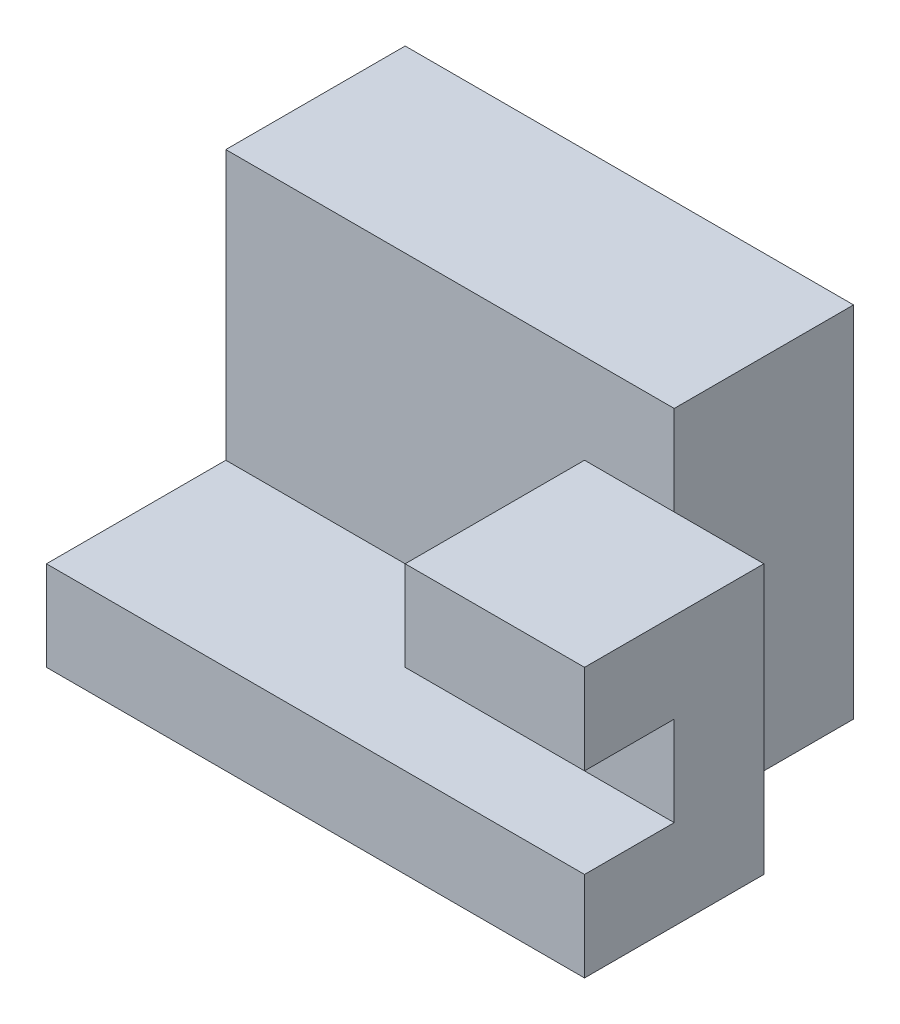
ISO-10303-21;
HEADER;
FILE_DESCRIPTION(('STEP AP214'),'2;1');
FILE_NAME('part.step','',(''),(''),'','','');
FILE_SCHEMA(('AUTOMOTIVE_DESIGN { 1 0 10303 214 1 1 1 1 }'));
ENDSEC;
DATA;
#1=APPLICATION_CONTEXT('core data for automotive mechanical design processes');
#2=APPLICATION_PROTOCOL_DEFINITION('international standard','automotive_design',2000,#1);
#3=PRODUCT_CONTEXT('',#1,'mechanical');
#4=PRODUCT('Part','Part','',(#3));
#5=PRODUCT_RELATED_PRODUCT_CATEGORY('part','',(#4));
#6=PRODUCT_DEFINITION_FORMATION('','',#4);
#7=PRODUCT_DEFINITION_CONTEXT('part definition',#1,'design');
#8=PRODUCT_DEFINITION('design','',#6,#7);
#9=PRODUCT_DEFINITION_SHAPE('','',#8);
#10=(LENGTH_UNIT() NAMED_UNIT(*) SI_UNIT(.MILLI.,.METRE.));
#11=(NAMED_UNIT(*) PLANE_ANGLE_UNIT() SI_UNIT($,.RADIAN.));
#12=(NAMED_UNIT(*) SI_UNIT($,.STERADIAN.) SOLID_ANGLE_UNIT());
#13=UNCERTAINTY_MEASURE_WITH_UNIT(LENGTH_MEASURE(1.E-05),#10,'distance_accuracy_value','');
#14=(GEOMETRIC_REPRESENTATION_CONTEXT(3) GLOBAL_UNCERTAINTY_ASSIGNED_CONTEXT((#13)) GLOBAL_UNIT_ASSIGNED_CONTEXT((#10,
#11,#12)) REPRESENTATION_CONTEXT('',''));
#15=CARTESIAN_POINT('',(0.,0.,0.));
#16=DIRECTION('',(0.,0.,1.));
#17=DIRECTION('',(1.,0.,0.));
#18=AXIS2_PLACEMENT_3D('',#15,#16,#17);
#19=CARTESIAN_POINT('',(-25.,0.,10.));
#20=DIRECTION('',(0.,0.,-1.));
#21=DIRECTION('',(-1.,0.,0.));
#22=AXIS2_PLACEMENT_3D('',#19,#20,#21);
#23=PLANE('',#22);
#24=DIRECTION('',(0.,-1.,0.));
#25=VECTOR('',#24,1.);
#26=CARTESIAN_POINT('',(5.,0.,10.));
#27=LINE('',#26,#25);
#28=CARTESIAN_POINT('',(5.,5.,10.));
#29=VERTEX_POINT('',#28);
#30=CARTESIAN_POINT('',(5.,0.,10.));
#31=VERTEX_POINT('',#30);
#32=EDGE_CURVE('E158',#29,#31,#27,.T.);
#33=ORIENTED_EDGE('',*,*,#32,.F.);
#34=DIRECTION('',(1.,0.,0.));
#35=VECTOR('',#34,1.);
#36=CARTESIAN_POINT('',(-25.,5.,10.));
#37=LINE('',#36,#35);
#38=CARTESIAN_POINT('',(-25.,5.,10.));
#39=VERTEX_POINT('',#38);
#40=EDGE_CURVE('E11',#39,#29,#37,.T.);
#41=ORIENTED_EDGE('',*,*,#40,.F.);
#42=DIRECTION('',(0.,1.,0.));
#43=VECTOR('',#42,1.);
#44=CARTESIAN_POINT('',(-25.,0.,10.));
#45=LINE('',#44,#43);
#46=CARTESIAN_POINT('',(-25.,0.,10.));
#47=VERTEX_POINT('',#46);
#48=EDGE_CURVE('E188',#47,#39,#45,.T.);
#49=ORIENTED_EDGE('',*,*,#48,.F.);
#50=DIRECTION('',(1.,0.,0.));
#51=VECTOR('',#50,1.);
#52=CARTESIAN_POINT('',(-25.,0.,10.));
#53=LINE('',#52,#51);
#54=EDGE_CURVE('E36',#47,#31,#53,.T.);
#55=ORIENTED_EDGE('',*,*,#54,.T.);
#56=EDGE_LOOP('',(#33,#41,#49,#55));
#57=FACE_BOUND('',#56,.T.);
#58=ADVANCED_FACE('F33',(#57),#23,.F.);
#59=CARTESIAN_POINT('',(-25.,5.,0.));
#60=DIRECTION('',(0.,1.,0.));
#61=DIRECTION('',(0.,0.,1.));
#62=AXIS2_PLACEMENT_3D('',#59,#60,#61);
#63=PLANE('',#62);
#64=DIRECTION('',(1.,0.,0.));
#65=VECTOR('',#64,1.);
#66=CARTESIAN_POINT('',(-5.,5.,5.));
#67=LINE('',#66,#65);
#68=CARTESIAN_POINT('',(-5.,5.,5.));
#69=VERTEX_POINT('',#68);
#70=CARTESIAN_POINT('',(5.,5.,5.));
#71=VERTEX_POINT('',#70);
#72=EDGE_CURVE('E49',#69,#71,#67,.T.);
#73=ORIENTED_EDGE('',*,*,#72,.F.);
#74=DIRECTION('',(0.,0.,-1.));
#75=VECTOR('',#74,1.);
#76=CARTESIAN_POINT('',(-5.,5.,0.));
#77=LINE('',#76,#75);
#78=CARTESIAN_POINT('',(-5.,5.,0.));
#79=VERTEX_POINT('',#78);
#80=EDGE_CURVE('E178',#69,#79,#77,.T.);
#81=ORIENTED_EDGE('',*,*,#80,.T.);
#82=DIRECTION('',(1.,0.,0.));
#83=VECTOR('',#82,1.);
#84=CARTESIAN_POINT('',(-25.,5.,0.));
#85=LINE('',#84,#83);
#86=CARTESIAN_POINT('',(-25.,5.,0.));
#87=VERTEX_POINT('',#86);
#88=EDGE_CURVE('E41',#87,#79,#85,.T.);
#89=ORIENTED_EDGE('',*,*,#88,.F.);
#90=DIRECTION('',(0.,0.,1.));
#91=VECTOR('',#90,1.);
#92=CARTESIAN_POINT('',(-25.,5.,0.));
#93=LINE('',#92,#91);
#94=EDGE_CURVE('E200',#87,#39,#93,.T.);
#95=ORIENTED_EDGE('',*,*,#94,.T.);
#96=ORIENTED_EDGE('',*,*,#40,.T.);
#97=DIRECTION('',(0.,0.,1.));
#98=VECTOR('',#97,1.);
#99=CARTESIAN_POINT('',(5.,5.,5.));
#100=LINE('',#99,#98);
#101=EDGE_CURVE('E155',#71,#29,#100,.T.);
#102=ORIENTED_EDGE('',*,*,#101,.F.);
#103=EDGE_LOOP('',(#73,#81,#89,#95,#96,#102));
#104=FACE_BOUND('',#103,.T.);
#105=ADVANCED_FACE('F243',(#104),#63,.T.);
#106=CARTESIAN_POINT('',(-25.,0.,0.));
#107=DIRECTION('',(0.,0.,-1.));
#108=DIRECTION('',(-1.,0.,0.));
#109=AXIS2_PLACEMENT_3D('',#106,#107,#108);
#110=PLANE('',#109);
#111=DIRECTION('',(0.,1.,0.));
#112=VECTOR('',#111,1.);
#113=CARTESIAN_POINT('',(-5.,15.,0.));
#114=LINE('',#113,#112);
#115=CARTESIAN_POINT('',(-5.,15.,0.));
#116=VERTEX_POINT('',#115);
#117=EDGE_CURVE('E57',#79,#116,#114,.T.);
#118=ORIENTED_EDGE('',*,*,#117,.T.);
#119=DIRECTION('',(1.,0.,0.));
#120=VECTOR('',#119,1.);
#121=CARTESIAN_POINT('',(-5.,15.,0.));
#122=LINE('',#121,#120);
#123=CARTESIAN_POINT('',(0.,15.,0.));
#124=VERTEX_POINT('',#123);
#125=EDGE_CURVE('E179',#116,#124,#122,.T.);
#126=ORIENTED_EDGE('',*,*,#125,.T.);
#127=DIRECTION('',(0.,1.,0.));
#128=VECTOR('',#127,1.);
#129=CARTESIAN_POINT('',(0.,0.,0.));
#130=LINE('',#129,#128);
#131=CARTESIAN_POINT('',(0.,20.,0.));
#132=VERTEX_POINT('',#131);
#133=EDGE_CURVE('E211',#124,#132,#130,.T.);
#134=ORIENTED_EDGE('',*,*,#133,.T.);
#135=DIRECTION('',(1.,0.,0.));
#136=VECTOR('',#135,1.);
#137=CARTESIAN_POINT('',(-25.,20.,0.));
#138=LINE('',#137,#136);
#139=CARTESIAN_POINT('',(-25.,20.,0.));
#140=VERTEX_POINT('',#139);
#141=EDGE_CURVE('E215',#140,#132,#138,.T.);
#142=ORIENTED_EDGE('',*,*,#141,.F.);
#143=DIRECTION('',(0.,1.,0.));
#144=VECTOR('',#143,1.);
#145=CARTESIAN_POINT('',(-25.,0.,0.));
#146=LINE('',#145,#144);
#147=EDGE_CURVE('E198',#87,#140,#146,.T.);
#148=ORIENTED_EDGE('',*,*,#147,.F.);
#149=ORIENTED_EDGE('',*,*,#88,.T.);
#150=EDGE_LOOP('',(#118,#126,#134,#142,#148,#149));
#151=FACE_BOUND('',#150,.T.);
#152=ADVANCED_FACE('F259',(#151),#110,.F.);
#153=CARTESIAN_POINT('',(-25.,20.,0.));
#154=DIRECTION('',(0.,-1.,0.));
#155=DIRECTION('',(0.,0.,-1.));
#156=AXIS2_PLACEMENT_3D('',#153,#154,#155);
#157=PLANE('',#156);
#158=DIRECTION('',(0.,0.,-1.));
#159=VECTOR('',#158,1.);
#160=CARTESIAN_POINT('',(0.,20.,0.));
#161=LINE('',#160,#159);
#162=CARTESIAN_POINT('',(0.,20.,-10.));
#163=VERTEX_POINT('',#162);
#164=EDGE_CURVE('E208',#132,#163,#161,.T.);
#165=ORIENTED_EDGE('',*,*,#164,.T.);
#166=DIRECTION('',(1.,0.,0.));
#167=VECTOR('',#166,1.);
#168=CARTESIAN_POINT('',(-25.,20.,-10.));
#169=LINE('',#168,#167);
#170=CARTESIAN_POINT('',(-25.,20.,-10.));
#171=VERTEX_POINT('',#170);
#172=EDGE_CURVE('E218',#171,#163,#169,.T.);
#173=ORIENTED_EDGE('',*,*,#172,.F.);
#174=DIRECTION('',(0.,0.,-1.));
#175=VECTOR('',#174,1.);
#176=CARTESIAN_POINT('',(-25.,20.,0.));
#177=LINE('',#176,#175);
#178=EDGE_CURVE('E196',#140,#171,#177,.T.);
#179=ORIENTED_EDGE('',*,*,#178,.F.);
#180=ORIENTED_EDGE('',*,*,#141,.T.);
#181=EDGE_LOOP('',(#165,#173,#179,#180));
#182=FACE_BOUND('',#181,.T.);
#183=ADVANCED_FACE('F261',(#182),#157,.F.);
#184=CARTESIAN_POINT('',(-25.,0.,-10.));
#185=DIRECTION('',(0.,0.,-1.));
#186=DIRECTION('',(-1.,0.,0.));
#187=AXIS2_PLACEMENT_3D('',#184,#185,#186);
#188=PLANE('',#187);
#189=DIRECTION('',(0.,1.,0.));
#190=VECTOR('',#189,1.);
#191=CARTESIAN_POINT('',(0.,0.,-10.));
#192=LINE('',#191,#190);
#193=CARTESIAN_POINT('',(0.,0.,-10.));
#194=VERTEX_POINT('',#193);
#195=EDGE_CURVE('E205',#194,#163,#192,.T.);
#196=ORIENTED_EDGE('',*,*,#195,.F.);
#197=DIRECTION('',(1.,0.,0.));
#198=VECTOR('',#197,1.);
#199=CARTESIAN_POINT('',(-25.,0.,-10.));
#200=LINE('',#199,#198);
#201=CARTESIAN_POINT('',(-25.,0.,-10.));
#202=VERTEX_POINT('',#201);
#203=EDGE_CURVE('E219',#202,#194,#200,.T.);
#204=ORIENTED_EDGE('',*,*,#203,.F.);
#205=DIRECTION('',(0.,1.,0.));
#206=VECTOR('',#205,1.);
#207=CARTESIAN_POINT('',(-25.,0.,-10.));
#208=LINE('',#207,#206);
#209=EDGE_CURVE('E193',#202,#171,#208,.T.);
#210=ORIENTED_EDGE('',*,*,#209,.T.);
#211=ORIENTED_EDGE('',*,*,#172,.T.);
#212=EDGE_LOOP('',(#196,#204,#210,#211));
#213=FACE_BOUND('',#212,.T.);
#214=ADVANCED_FACE('F254',(#213),#188,.T.);
#215=CARTESIAN_POINT('',(-25.,0.,0.));
#216=DIRECTION('',(0.,1.,0.));
#217=DIRECTION('',(0.,0.,1.));
#218=AXIS2_PLACEMENT_3D('',#215,#216,#217);
#219=PLANE('',#218);
#220=DIRECTION('',(0.,0.,1.));
#221=VECTOR('',#220,1.);
#222=CARTESIAN_POINT('',(0.,0.,0.));
#223=LINE('',#222,#221);
#224=CARTESIAN_POINT('',(0.,0.,0.));
#225=VERTEX_POINT('',#224);
#226=EDGE_CURVE('E187',#194,#225,#223,.T.);
#227=ORIENTED_EDGE('',*,*,#226,.T.);
#228=DIRECTION('',(1.,0.,0.));
#229=VECTOR('',#228,1.);
#230=CARTESIAN_POINT('',(-5.,0.,0.));
#231=LINE('',#230,#229);
#232=CARTESIAN_POINT('',(5.,0.,0.));
#233=VERTEX_POINT('',#232);
#234=EDGE_CURVE('E182',#225,#233,#231,.T.);
#235=ORIENTED_EDGE('',*,*,#234,.T.);
#236=DIRECTION('',(0.,0.,-1.));
#237=VECTOR('',#236,1.);
#238=CARTESIAN_POINT('',(5.,0.,0.));
#239=LINE('',#238,#237);
#240=EDGE_CURVE('E161',#31,#233,#239,.T.);
#241=ORIENTED_EDGE('',*,*,#240,.F.);
#242=ORIENTED_EDGE('',*,*,#54,.F.);
#243=DIRECTION('',(0.,0.,1.));
#244=VECTOR('',#243,1.);
#245=CARTESIAN_POINT('',(-25.,0.,0.));
#246=LINE('',#245,#244);
#247=EDGE_CURVE('E190',#202,#47,#246,.T.);
#248=ORIENTED_EDGE('',*,*,#247,.F.);
#249=ORIENTED_EDGE('',*,*,#203,.T.);
#250=EDGE_LOOP('',(#227,#235,#241,#242,#248,#249));
#251=FACE_BOUND('',#250,.T.);
#252=ADVANCED_FACE('F230',(#251),#219,.F.);
#253=CARTESIAN_POINT('',(-25.,0.,0.));
#254=DIRECTION('',(1.,0.,0.));
#255=DIRECTION('',(0.,0.,-1.));
#256=AXIS2_PLACEMENT_3D('',#253,#254,#255);
#257=PLANE('',#256);
#258=ORIENTED_EDGE('',*,*,#48,.T.);
#259=ORIENTED_EDGE('',*,*,#94,.F.);
#260=ORIENTED_EDGE('',*,*,#147,.T.);
#261=ORIENTED_EDGE('',*,*,#178,.T.);
#262=ORIENTED_EDGE('',*,*,#209,.F.);
#263=ORIENTED_EDGE('',*,*,#247,.T.);
#264=EDGE_LOOP('',(#258,#259,#260,#261,#262,#263));
#265=FACE_BOUND('',#264,.T.);
#266=ADVANCED_FACE('F247',(#265),#257,.F.);
#267=CARTESIAN_POINT('',(0.,0.,0.));
#268=DIRECTION('',(1.,0.,0.));
#269=DIRECTION('',(0.,0.,-1.));
#270=AXIS2_PLACEMENT_3D('',#267,#268,#269);
#271=PLANE('',#270);
#272=EDGE_CURVE('E191',#225,#124,#130,.T.);
#273=ORIENTED_EDGE('',*,*,#272,.F.);
#274=ORIENTED_EDGE('',*,*,#226,.F.);
#275=ORIENTED_EDGE('',*,*,#195,.T.);
#276=ORIENTED_EDGE('',*,*,#164,.F.);
#277=ORIENTED_EDGE('',*,*,#133,.F.);
#278=EDGE_LOOP('',(#273,#274,#275,#276,#277));
#279=FACE_BOUND('',#278,.T.);
#280=ADVANCED_FACE('F257',(#279),#271,.T.);
#281=CARTESIAN_POINT('',(-5.,15.,10.));
#282=DIRECTION('',(0.,0.,1.));
#283=DIRECTION('',(1.,0.,0.));
#284=AXIS2_PLACEMENT_3D('',#281,#282,#283);
#285=PLANE('',#284);
#286=DIRECTION('',(1.,0.,0.));
#287=VECTOR('',#286,1.);
#288=CARTESIAN_POINT('',(-5.,10.,10.));
#289=LINE('',#288,#287);
#290=CARTESIAN_POINT('',(-5.,10.,10.));
#291=VERTEX_POINT('',#290);
#292=CARTESIAN_POINT('',(5.,10.,10.));
#293=VERTEX_POINT('',#292);
#294=EDGE_CURVE('E126',#291,#293,#289,.T.);
#295=ORIENTED_EDGE('',*,*,#294,.T.);
#296=DIRECTION('',(0.,-1.,0.));
#297=VECTOR('',#296,1.);
#298=CARTESIAN_POINT('',(5.,15.,10.));
#299=LINE('',#298,#297);
#300=CARTESIAN_POINT('',(5.,15.,10.));
#301=VERTEX_POINT('',#300);
#302=EDGE_CURVE('E130',#301,#293,#299,.T.);
#303=ORIENTED_EDGE('',*,*,#302,.F.);
#304=DIRECTION('',(1.,0.,0.));
#305=VECTOR('',#304,1.);
#306=CARTESIAN_POINT('',(-5.,15.,10.));
#307=LINE('',#306,#305);
#308=CARTESIAN_POINT('',(-5.,15.,10.));
#309=VERTEX_POINT('',#308);
#310=EDGE_CURVE('E176',#309,#301,#307,.T.);
#311=ORIENTED_EDGE('',*,*,#310,.F.);
#312=DIRECTION('',(0.,-1.,0.));
#313=VECTOR('',#312,1.);
#314=CARTESIAN_POINT('',(-5.,15.,10.));
#315=LINE('',#314,#313);
#316=EDGE_CURVE('E132',#309,#291,#315,.T.);
#317=ORIENTED_EDGE('',*,*,#316,.T.);
#318=EDGE_LOOP('',(#295,#303,#311,#317));
#319=FACE_BOUND('',#318,.T.);
#320=ADVANCED_FACE('F128',(#319),#285,.T.);
#321=CARTESIAN_POINT('',(-5.,15.,10.));
#322=DIRECTION('',(0.,1.,0.));
#323=DIRECTION('',(0.,0.,1.));
#324=AXIS2_PLACEMENT_3D('',#321,#322,#323);
#325=PLANE('',#324);
#326=ORIENTED_EDGE('',*,*,#310,.T.);
#327=DIRECTION('',(0.,0.,1.));
#328=VECTOR('',#327,1.);
#329=CARTESIAN_POINT('',(5.,15.,10.));
#330=LINE('',#329,#328);
#331=CARTESIAN_POINT('',(5.,15.,0.));
#332=VERTEX_POINT('',#331);
#333=EDGE_CURVE('E151',#332,#301,#330,.T.);
#334=ORIENTED_EDGE('',*,*,#333,.F.);
#335=EDGE_CURVE('E181',#124,#332,#122,.T.);
#336=ORIENTED_EDGE('',*,*,#335,.F.);
#337=ORIENTED_EDGE('',*,*,#125,.F.);
#338=DIRECTION('',(0.,0.,1.));
#339=VECTOR('',#338,1.);
#340=CARTESIAN_POINT('',(-5.,15.,10.));
#341=LINE('',#340,#339);
#342=EDGE_CURVE('E137',#116,#309,#341,.T.);
#343=ORIENTED_EDGE('',*,*,#342,.T.);
#344=EDGE_LOOP('',(#326,#334,#336,#337,#343));
#345=FACE_BOUND('',#344,.T.);
#346=ADVANCED_FACE('F236',(#345),#325,.T.);
#347=CARTESIAN_POINT('',(-5.,15.,0.));
#348=DIRECTION('',(0.,0.,-1.));
#349=DIRECTION('',(0.,1.,0.));
#350=AXIS2_PLACEMENT_3D('',#347,#348,#349);
#351=PLANE('',#350);
#352=ORIENTED_EDGE('',*,*,#234,.F.);
#353=ORIENTED_EDGE('',*,*,#272,.T.);
#354=ORIENTED_EDGE('',*,*,#335,.T.);
#355=DIRECTION('',(0.,1.,0.));
#356=VECTOR('',#355,1.);
#357=CARTESIAN_POINT('',(5.,15.,0.));
#358=LINE('',#357,#356);
#359=EDGE_CURVE('E164',#233,#332,#358,.T.);
#360=ORIENTED_EDGE('',*,*,#359,.F.);
#361=EDGE_LOOP('',(#352,#353,#354,#360));
#362=FACE_BOUND('',#361,.T.);
#363=ADVANCED_FACE('F233',(#362),#351,.T.);
#364=CARTESIAN_POINT('',(-5.,10.,5.));
#365=DIRECTION('',(0.,0.,1.));
#366=DIRECTION('',(0.,-1.,0.));
#367=AXIS2_PLACEMENT_3D('',#364,#365,#366);
#368=PLANE('',#367);
#369=ORIENTED_EDGE('',*,*,#72,.T.);
#370=DIRECTION('',(0.,-1.,0.));
#371=VECTOR('',#370,1.);
#372=CARTESIAN_POINT('',(5.,10.,5.));
#373=LINE('',#372,#371);
#374=CARTESIAN_POINT('',(5.,10.,5.));
#375=VERTEX_POINT('',#374);
#376=EDGE_CURVE('E145',#375,#71,#373,.T.);
#377=ORIENTED_EDGE('',*,*,#376,.F.);
#378=DIRECTION('',(1.,0.,0.));
#379=VECTOR('',#378,1.);
#380=CARTESIAN_POINT('',(-5.,10.,5.));
#381=LINE('',#380,#379);
#382=CARTESIAN_POINT('',(-5.,10.,5.));
#383=VERTEX_POINT('',#382);
#384=EDGE_CURVE('E136',#383,#375,#381,.T.);
#385=ORIENTED_EDGE('',*,*,#384,.F.);
#386=DIRECTION('',(0.,-1.,0.));
#387=VECTOR('',#386,1.);
#388=CARTESIAN_POINT('',(-5.,10.,5.));
#389=LINE('',#388,#387);
#390=EDGE_CURVE('E170',#383,#69,#389,.T.);
#391=ORIENTED_EDGE('',*,*,#390,.T.);
#392=EDGE_LOOP('',(#369,#377,#385,#391));
#393=FACE_BOUND('',#392,.T.);
#394=ADVANCED_FACE('F242',(#393),#368,.T.);
#395=CARTESIAN_POINT('',(-5.,10.,10.));
#396=DIRECTION('',(0.,-1.,0.));
#397=DIRECTION('',(0.,0.,-1.));
#398=AXIS2_PLACEMENT_3D('',#395,#396,#397);
#399=PLANE('',#398);
#400=ORIENTED_EDGE('',*,*,#384,.T.);
#401=DIRECTION('',(0.,0.,-1.));
#402=VECTOR('',#401,1.);
#403=CARTESIAN_POINT('',(5.,10.,10.));
#404=LINE('',#403,#402);
#405=EDGE_CURVE('E140',#293,#375,#404,.T.);
#406=ORIENTED_EDGE('',*,*,#405,.F.);
#407=ORIENTED_EDGE('',*,*,#294,.F.);
#408=DIRECTION('',(0.,0.,-1.));
#409=VECTOR('',#408,1.);
#410=CARTESIAN_POINT('',(-5.,10.,10.));
#411=LINE('',#410,#409);
#412=EDGE_CURVE('E168',#291,#383,#411,.T.);
#413=ORIENTED_EDGE('',*,*,#412,.T.);
#414=EDGE_LOOP('',(#400,#406,#407,#413));
#415=FACE_BOUND('',#414,.T.);
#416=ADVANCED_FACE('F141',(#415),#399,.T.);
#417=CARTESIAN_POINT('',(-5.,0.,0.));
#418=DIRECTION('',(1.,0.,0.));
#419=DIRECTION('',(0.,0.,-1.));
#420=AXIS2_PLACEMENT_3D('',#417,#418,#419);
#421=PLANE('',#420);
#422=ORIENTED_EDGE('',*,*,#80,.F.);
#423=ORIENTED_EDGE('',*,*,#390,.F.);
#424=ORIENTED_EDGE('',*,*,#412,.F.);
#425=ORIENTED_EDGE('',*,*,#316,.F.);
#426=ORIENTED_EDGE('',*,*,#342,.F.);
#427=ORIENTED_EDGE('',*,*,#117,.F.);
#428=EDGE_LOOP('',(#422,#423,#424,#425,#426,#427));
#429=FACE_BOUND('',#428,.T.);
#430=ADVANCED_FACE('F239',(#429),#421,.F.);
#431=CARTESIAN_POINT('',(5.,0.,0.));
#432=DIRECTION('',(1.,0.,0.));
#433=DIRECTION('',(0.,0.,-1.));
#434=AXIS2_PLACEMENT_3D('',#431,#432,#433);
#435=PLANE('',#434);
#436=ORIENTED_EDGE('',*,*,#302,.T.);
#437=ORIENTED_EDGE('',*,*,#405,.T.);
#438=ORIENTED_EDGE('',*,*,#376,.T.);
#439=ORIENTED_EDGE('',*,*,#101,.T.);
#440=ORIENTED_EDGE('',*,*,#32,.T.);
#441=ORIENTED_EDGE('',*,*,#240,.T.);
#442=ORIENTED_EDGE('',*,*,#359,.T.);
#443=ORIENTED_EDGE('',*,*,#333,.T.);
#444=EDGE_LOOP('',(#436,#437,#438,#439,#440,#441,#442,#443));
#445=FACE_BOUND('',#444,.T.);
#446=ADVANCED_FACE('F148',(#445),#435,.T.);
#447=CLOSED_SHELL('',(#58,#105,#152,#183,#214,#252,#266,#280,#320,#346,#363,#394,#416,#430,#446));
#448=MANIFOLD_SOLID_BREP('B2',#447);
#449=ADVANCED_BREP_SHAPE_REPRESENTATION('',(#18,#448),#14);
#450=SHAPE_DEFINITION_REPRESENTATION(#9,#449);
ENDSEC;
END-ISO-10303-21;
